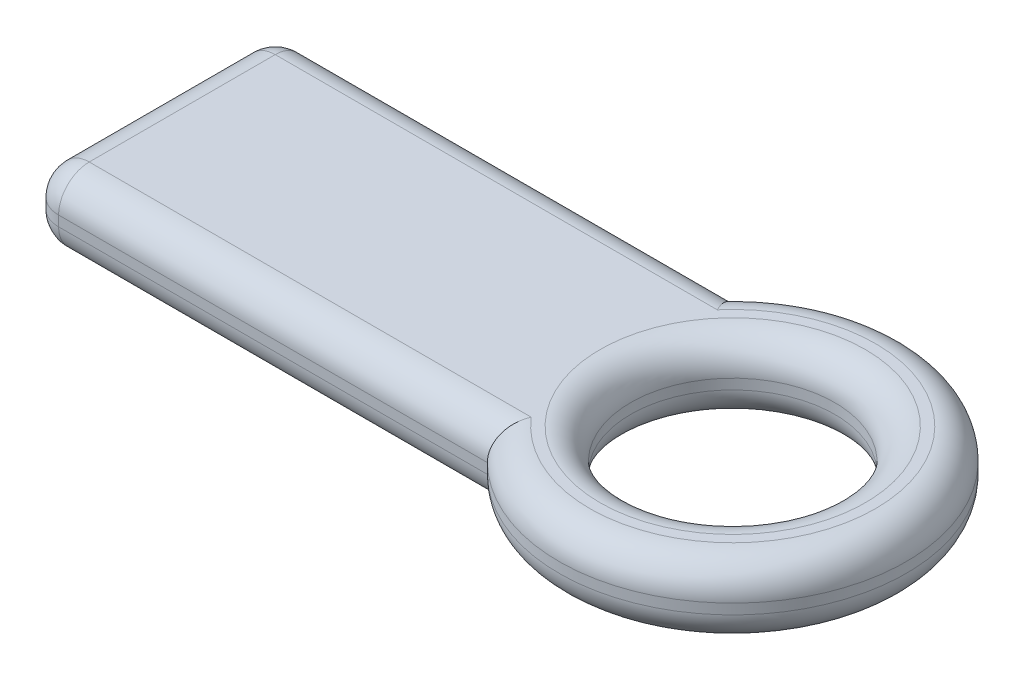
ISO-10303-21;
HEADER;
FILE_DESCRIPTION(('STEP AP214'),'2;1');
FILE_NAME('part.step','',(''),(''),'','','');
FILE_SCHEMA(('AUTOMOTIVE_DESIGN { 1 0 10303 214 1 1 1 1 }'));
ENDSEC;
DATA;
#1=APPLICATION_CONTEXT('core data for automotive mechanical design processes');
#2=APPLICATION_PROTOCOL_DEFINITION('international standard','automotive_design',2000,#1);
#3=PRODUCT_CONTEXT('',#1,'mechanical');
#4=PRODUCT('Part','Part','',(#3));
#5=PRODUCT_RELATED_PRODUCT_CATEGORY('part','',(#4));
#6=PRODUCT_DEFINITION_FORMATION('','',#4);
#7=PRODUCT_DEFINITION_CONTEXT('part definition',#1,'design');
#8=PRODUCT_DEFINITION('design','',#6,#7);
#9=PRODUCT_DEFINITION_SHAPE('','',#8);
#10=(LENGTH_UNIT() NAMED_UNIT(*) SI_UNIT(.MILLI.,.METRE.));
#11=(NAMED_UNIT(*) PLANE_ANGLE_UNIT() SI_UNIT($,.RADIAN.));
#12=(NAMED_UNIT(*) SI_UNIT($,.STERADIAN.) SOLID_ANGLE_UNIT());
#13=UNCERTAINTY_MEASURE_WITH_UNIT(LENGTH_MEASURE(1.E-05),#10,'distance_accuracy_value','');
#14=(GEOMETRIC_REPRESENTATION_CONTEXT(3) GLOBAL_UNCERTAINTY_ASSIGNED_CONTEXT((#13)) GLOBAL_UNIT_ASSIGNED_CONTEXT((#10,
#11,#12)) REPRESENTATION_CONTEXT('',''));
#15=CARTESIAN_POINT('',(0.,0.,0.));
#16=DIRECTION('',(0.,0.,1.));
#17=DIRECTION('',(1.,0.,0.));
#18=AXIS2_PLACEMENT_3D('',#15,#16,#17);
#19=CARTESIAN_POINT('',(284.65,35.,-60.555));
#20=DIRECTION('',(0.,1.,0.));
#21=DIRECTION('',(0.,0.,1.));
#22=AXIS2_PLACEMENT_3D('',#19,#20,#21);
#23=PLANE('',#22);
#24=CARTESIAN_POINT('',(284.65,35.,-60.555));
#25=DIRECTION('',(0.,1.,0.));
#26=DIRECTION('',(0.,0.,1.));
#27=AXIS2_PLACEMENT_3D('',#24,#25,#26);
#28=CIRCLE('',#27,65.);
#29=CARTESIAN_POINT('',(284.65,35.,4.445));
#30=VERTEX_POINT('',#29);
#31=EDGE_CURVE('E151',#30,#30,#28,.F.);
#32=ORIENTED_EDGE('',*,*,#31,.T.);
#33=EDGE_LOOP('',(#32));
#34=FACE_BOUND('',#33,.T.);
#35=DIRECTION('',(-1.,0.,0.));
#36=VECTOR('',#35,1.);
#37=CARTESIAN_POINT('',(0.,35.,-106.11));
#38=LINE('',#37,#36);
#39=CARTESIAN_POINT('',(231.501698286775,35.,-106.11));
#40=VERTEX_POINT('',#39);
#41=CARTESIAN_POINT('',(15.,35.,-106.11));
#42=VERTEX_POINT('',#41);
#43=EDGE_CURVE('E154',#40,#42,#38,.T.);
#44=ORIENTED_EDGE('',*,*,#43,.T.);
#45=DIRECTION('',(0.,0.,1.));
#46=VECTOR('',#45,1.);
#47=CARTESIAN_POINT('',(15.,35.,-15.));
#48=LINE('',#47,#46);
#49=CARTESIAN_POINT('',(15.,35.,-15.));
#50=VERTEX_POINT('',#49);
#51=EDGE_CURVE('E11',#42,#50,#48,.T.);
#52=ORIENTED_EDGE('',*,*,#51,.T.);
#53=DIRECTION('',(1.,0.,0.));
#54=VECTOR('',#53,1.);
#55=CARTESIAN_POINT('',(225.00025586811,35.,-15.));
#56=LINE('',#55,#54);
#57=CARTESIAN_POINT('',(231.501698286775,35.,-15.));
#58=VERTEX_POINT('',#57);
#59=EDGE_CURVE('E272',#50,#58,#56,.T.);
#60=ORIENTED_EDGE('',*,*,#59,.T.);
#61=CARTESIAN_POINT('',(284.65,35.,-60.555));
#62=DIRECTION('',(0.,1.,0.));
#63=DIRECTION('',(0.,0.,1.));
#64=AXIS2_PLACEMENT_3D('',#61,#62,#63);
#65=CIRCLE('',#64,70.);
#66=EDGE_CURVE('E270',#58,#40,#65,.T.);
#67=ORIENTED_EDGE('',*,*,#66,.T.);
#68=EDGE_LOOP('',(#44,#52,#60,#67));
#69=FACE_BOUND('',#68,.T.);
#70=ADVANCED_FACE('F39',(#34,#69),#23,.T.);
#71=CARTESIAN_POINT('',(284.65,0.,-60.555));
#72=DIRECTION('',(0.,1.,0.));
#73=DIRECTION('',(0.,0.,1.));
#74=AXIS2_PLACEMENT_3D('',#71,#72,#73);
#75=PLANE('',#74);
#76=CARTESIAN_POINT('',(284.65,0.,-60.555));
#77=DIRECTION('',(0.,1.,0.));
#78=DIRECTION('',(0.,0.,1.));
#79=AXIS2_PLACEMENT_3D('',#76,#77,#78);
#80=CIRCLE('',#79,65.);
#81=CARTESIAN_POINT('',(284.65,0.,4.445));
#82=VERTEX_POINT('',#81);
#83=EDGE_CURVE('E280',#82,#82,#80,.T.);
#84=ORIENTED_EDGE('',*,*,#83,.T.);
#85=EDGE_LOOP('',(#84));
#86=FACE_BOUND('',#85,.T.);
#87=DIRECTION('',(1.,0.,0.));
#88=VECTOR('',#87,1.);
#89=CARTESIAN_POINT('',(284.65,0.,-15.));
#90=LINE('',#89,#88);
#91=CARTESIAN_POINT('',(231.501698286775,0.,-15.));
#92=VERTEX_POINT('',#91);
#93=CARTESIAN_POINT('',(15.,0.,-15.));
#94=VERTEX_POINT('',#93);
#95=EDGE_CURVE('E287',#92,#94,#90,.F.);
#96=ORIENTED_EDGE('',*,*,#95,.T.);
#97=DIRECTION('',(0.,0.,1.));
#98=VECTOR('',#97,1.);
#99=CARTESIAN_POINT('',(15.,0.,-60.555));
#100=LINE('',#99,#98);
#101=CARTESIAN_POINT('',(15.,0.,-106.11));
#102=VERTEX_POINT('',#101);
#103=EDGE_CURVE('E48',#94,#102,#100,.F.);
#104=ORIENTED_EDGE('',*,*,#103,.T.);
#105=DIRECTION('',(-1.,0.,0.));
#106=VECTOR('',#105,1.);
#107=CARTESIAN_POINT('',(284.65,0.,-106.11));
#108=LINE('',#107,#106);
#109=CARTESIAN_POINT('',(231.501698286775,0.,-106.11));
#110=VERTEX_POINT('',#109);
#111=EDGE_CURVE('E283',#102,#110,#108,.F.);
#112=ORIENTED_EDGE('',*,*,#111,.T.);
#113=CARTESIAN_POINT('',(284.65,0.,-60.555));
#114=DIRECTION('',(0.,1.,0.));
#115=DIRECTION('',(0.,0.,1.));
#116=AXIS2_PLACEMENT_3D('',#113,#114,#115);
#117=CIRCLE('',#116,70.);
#118=EDGE_CURVE('E285',#110,#92,#117,.F.);
#119=ORIENTED_EDGE('',*,*,#118,.T.);
#120=EDGE_LOOP('',(#96,#104,#112,#119));
#121=FACE_BOUND('',#120,.T.);
#122=ADVANCED_FACE('F223',(#86,#121),#75,.F.);
#123=CARTESIAN_POINT('',(0.,35.,0.));
#124=DIRECTION('',(1.,0.,0.));
#125=DIRECTION('',(0.,0.,-1.));
#126=AXIS2_PLACEMENT_3D('',#123,#124,#125);
#127=PLANE('',#126);
#128=DIRECTION('',(0.,-1.,0.));
#129=VECTOR('',#128,1.);
#130=CARTESIAN_POINT('',(0.,35.,-106.11));
#131=LINE('',#130,#129);
#132=CARTESIAN_POINT('',(0.,20.,-106.11));
#133=VERTEX_POINT('',#132);
#134=CARTESIAN_POINT('',(0.,15.,-106.11));
#135=VERTEX_POINT('',#134);
#136=EDGE_CURVE('E342',#133,#135,#131,.T.);
#137=ORIENTED_EDGE('',*,*,#136,.T.);
#138=DIRECTION('',(0.,0.,1.));
#139=VECTOR('',#138,1.);
#140=CARTESIAN_POINT('',(0.,15.,0.));
#141=LINE('',#140,#139);
#142=CARTESIAN_POINT('',(0.,15.,-15.));
#143=VERTEX_POINT('',#142);
#144=EDGE_CURVE('E308',#135,#143,#141,.T.);
#145=ORIENTED_EDGE('',*,*,#144,.T.);
#146=DIRECTION('',(0.,-1.,0.));
#147=VECTOR('',#146,1.);
#148=CARTESIAN_POINT('',(0.,35.,-15.));
#149=LINE('',#148,#147);
#150=CARTESIAN_POINT('',(0.,20.,-15.));
#151=VERTEX_POINT('',#150);
#152=EDGE_CURVE('E344',#143,#151,#149,.F.);
#153=ORIENTED_EDGE('',*,*,#152,.T.);
#154=DIRECTION('',(0.,0.,1.));
#155=VECTOR('',#154,1.);
#156=CARTESIAN_POINT('',(0.,20.,-106.11));
#157=LINE('',#156,#155);
#158=EDGE_CURVE('E263',#151,#133,#157,.F.);
#159=ORIENTED_EDGE('',*,*,#158,.T.);
#160=EDGE_LOOP('',(#137,#145,#153,#159));
#161=FACE_BOUND('',#160,.T.);
#162=ADVANCED_FACE('F229',(#161),#127,.F.);
#163=CARTESIAN_POINT('',(0.,35.,0.));
#164=DIRECTION('',(0.,0.,-1.));
#165=DIRECTION('',(-1.,0.,0.));
#166=AXIS2_PLACEMENT_3D('',#163,#164,#165);
#167=PLANE('',#166);
#168=DIRECTION('',(1.,0.,0.));
#169=VECTOR('',#168,1.);
#170=CARTESIAN_POINT('',(0.,20.,0.));
#171=LINE('',#170,#169);
#172=CARTESIAN_POINT('',(225.00025586811,20.,0.));
#173=VERTEX_POINT('',#172);
#174=CARTESIAN_POINT('',(15.,20.,0.));
#175=VERTEX_POINT('',#174);
#176=EDGE_CURVE('E264',#173,#175,#171,.F.);
#177=ORIENTED_EDGE('',*,*,#176,.T.);
#178=DIRECTION('',(0.,-1.,0.));
#179=VECTOR('',#178,1.);
#180=CARTESIAN_POINT('',(15.,35.,0.));
#181=LINE('',#180,#179);
#182=CARTESIAN_POINT('',(15.,15.,0.));
#183=VERTEX_POINT('',#182);
#184=EDGE_CURVE('E337',#175,#183,#181,.T.);
#185=ORIENTED_EDGE('',*,*,#184,.T.);
#186=DIRECTION('',(1.,0.,0.));
#187=VECTOR('',#186,1.);
#188=CARTESIAN_POINT('',(0.,15.,0.));
#189=LINE('',#188,#187);
#190=CARTESIAN_POINT('',(225.00025586811,15.,0.));
#191=VERTEX_POINT('',#190);
#192=EDGE_CURVE('E261',#183,#191,#189,.T.);
#193=ORIENTED_EDGE('',*,*,#192,.T.);
#194=DIRECTION('',(0.,-1.,0.));
#195=VECTOR('',#194,1.);
#196=CARTESIAN_POINT('',(225.00025586811,35.,0.));
#197=LINE('',#196,#195);
#198=EDGE_CURVE('E131',#173,#191,#197,.T.);
#199=ORIENTED_EDGE('',*,*,#198,.F.);
#200=EDGE_LOOP('',(#177,#185,#193,#199));
#201=FACE_BOUND('',#200,.T.);
#202=ADVANCED_FACE('F240',(#201),#167,.F.);
#203=CARTESIAN_POINT('',(284.65,35.,-60.555));
#204=DIRECTION('',(0.,-1.,0.));
#205=DIRECTION('',(0.,0.,-1.));
#206=AXIS2_PLACEMENT_3D('',#203,#204,#205);
#207=CYLINDRICAL_SURFACE('',#206,85.);
#208=ORIENTED_EDGE('',*,*,#198,.T.);
#209=CARTESIAN_POINT('',(284.65,15.,-60.555));
#210=DIRECTION('',(0.,1.,0.));
#211=DIRECTION('',(0.,0.,1.));
#212=AXIS2_PLACEMENT_3D('',#209,#210,#211);
#213=CIRCLE('',#212,85.);
#214=CARTESIAN_POINT('',(225.00025586811,15.,-121.11));
#215=VERTEX_POINT('',#214);
#216=EDGE_CURVE('E140',#191,#215,#213,.T.);
#217=ORIENTED_EDGE('',*,*,#216,.T.);
#218=DIRECTION('',(0.,-1.,0.));
#219=VECTOR('',#218,1.);
#220=CARTESIAN_POINT('',(225.00025586811,35.,-121.11));
#221=LINE('',#220,#219);
#222=CARTESIAN_POINT('',(225.00025586811,20.,-121.11));
#223=VERTEX_POINT('',#222);
#224=EDGE_CURVE('E124',#223,#215,#221,.T.);
#225=ORIENTED_EDGE('',*,*,#224,.F.);
#226=CARTESIAN_POINT('',(284.65,20.,-60.555));
#227=DIRECTION('',(0.,1.,0.));
#228=DIRECTION('',(0.,0.,1.));
#229=AXIS2_PLACEMENT_3D('',#226,#227,#228);
#230=CIRCLE('',#229,85.);
#231=EDGE_CURVE('E137',#223,#173,#230,.F.);
#232=ORIENTED_EDGE('',*,*,#231,.T.);
#233=EDGE_LOOP('',(#208,#217,#225,#232));
#234=FACE_BOUND('',#233,.T.);
#235=ADVANCED_FACE('F136',(#234),#207,.T.);
#236=CARTESIAN_POINT('',(0.,35.,-121.11));
#237=DIRECTION('',(0.,0.,1.));
#238=DIRECTION('',(1.,0.,0.));
#239=AXIS2_PLACEMENT_3D('',#236,#237,#238);
#240=PLANE('',#239);
#241=DIRECTION('',(-1.,0.,0.));
#242=VECTOR('',#241,1.);
#243=CARTESIAN_POINT('',(0.,15.,-121.11));
#244=LINE('',#243,#242);
#245=CARTESIAN_POINT('',(15.,15.,-121.11));
#246=VERTEX_POINT('',#245);
#247=EDGE_CURVE('E130',#215,#246,#244,.T.);
#248=ORIENTED_EDGE('',*,*,#247,.T.);
#249=DIRECTION('',(0.,-1.,0.));
#250=VECTOR('',#249,1.);
#251=CARTESIAN_POINT('',(15.,35.,-121.11));
#252=LINE('',#251,#250);
#253=CARTESIAN_POINT('',(15.,20.,-121.11));
#254=VERTEX_POINT('',#253);
#255=EDGE_CURVE('E127',#246,#254,#252,.F.);
#256=ORIENTED_EDGE('',*,*,#255,.T.);
#257=DIRECTION('',(-1.,0.,0.));
#258=VECTOR('',#257,1.);
#259=CARTESIAN_POINT('',(225.00025586811,20.,-121.11));
#260=LINE('',#259,#258);
#261=EDGE_CURVE('E120',#254,#223,#260,.F.);
#262=ORIENTED_EDGE('',*,*,#261,.T.);
#263=ORIENTED_EDGE('',*,*,#224,.T.);
#264=EDGE_LOOP('',(#248,#256,#262,#263));
#265=FACE_BOUND('',#264,.T.);
#266=ADVANCED_FACE('F123',(#265),#240,.F.);
#267=CARTESIAN_POINT('',(284.65,35.,-60.555));
#268=DIRECTION('',(0.,-1.,0.));
#269=DIRECTION('',(0.,0.,-1.));
#270=AXIS2_PLACEMENT_3D('',#267,#268,#269);
#271=CYLINDRICAL_SURFACE('',#270,50.);
#272=CARTESIAN_POINT('',(284.65,15.,-60.555));
#273=DIRECTION('',(0.,1.,0.));
#274=DIRECTION('',(0.,0.,1.));
#275=AXIS2_PLACEMENT_3D('',#272,#273,#274);
#276=CIRCLE('',#275,50.);
#277=CARTESIAN_POINT('',(284.65,15.,-10.555));
#278=VERTEX_POINT('',#277);
#279=EDGE_CURVE('E274',#278,#278,#276,.F.);
#280=ORIENTED_EDGE('',*,*,#279,.T.);
#281=EDGE_LOOP('',(#280));
#282=FACE_BOUND('',#281,.T.);
#283=CARTESIAN_POINT('',(284.65,20.,-60.555));
#284=DIRECTION('',(0.,1.,0.));
#285=DIRECTION('',(0.,0.,1.));
#286=AXIS2_PLACEMENT_3D('',#283,#284,#285);
#287=CIRCLE('',#286,50.);
#288=CARTESIAN_POINT('',(284.65,20.,-10.555));
#289=VERTEX_POINT('',#288);
#290=EDGE_CURVE('E277',#289,#289,#287,.T.);
#291=ORIENTED_EDGE('',*,*,#290,.T.);
#292=EDGE_LOOP('',(#291));
#293=FACE_BOUND('',#292,.T.);
#294=ADVANCED_FACE('F234',(#282,#293),#271,.F.);
#295=CARTESIAN_POINT('',(0.,15.,-15.));
#296=DIRECTION('',(1.,0.,0.));
#297=DIRECTION('',(0.,0.,-1.));
#298=AXIS2_PLACEMENT_3D('',#295,#296,#297);
#299=CYLINDRICAL_SURFACE('',#298,15.);
#300=ORIENTED_EDGE('',*,*,#192,.F.);
#301=CARTESIAN_POINT('',(15.,15.,-15.));
#302=DIRECTION('',(1.,0.,0.));
#303=DIRECTION('',(0.,0.,-1.));
#304=AXIS2_PLACEMENT_3D('',#301,#302,#303);
#305=CIRCLE('',#304,15.);
#306=EDGE_CURVE('E62',#183,#94,#305,.T.);
#307=ORIENTED_EDGE('',*,*,#306,.T.);
#308=ORIENTED_EDGE('',*,*,#95,.F.);
#309=CARTESIAN_POINT('',(225.00025586811,15.,0.));
#310=CARTESIAN_POINT('',(225.000255807494,14.8007069053335,6.64547626748508E-07));
#311=CARTESIAN_POINT('',(225.001883817683,14.6014391188507,-0.00397252545556941));
#312=CARTESIAN_POINT('',(225.00839042128,14.2032789130897,-0.0198485816888192));
#313=CARTESIAN_POINT('',(225.01326891532,14.004386482523,-0.0317512055157053));
#314=CARTESIAN_POINT('',(225.032766680539,13.4089015315127,-0.0793137259211589));
#315=CARTESIAN_POINT('',(225.052248244729,13.0133397414191,-0.126828302427761));
#316=CARTESIAN_POINT('',(225.103943040883,12.2291399953268,-0.252807053070138));
#317=CARTESIAN_POINT('',(225.136123058065,11.8404867186587,-0.331190483851694));
#318=CARTESIAN_POINT('',(225.212947154574,11.0717435282955,-0.518105923828764));
#319=CARTESIAN_POINT('',(225.257591414536,10.6916537387911,-0.626638369952767));
#320=CARTESIAN_POINT('',(225.358965077365,9.94277435441357,-0.872728955280282));
#321=CARTESIAN_POINT('',(225.415691291013,9.57398180678616,-1.01027943463417));
#322=CARTESIAN_POINT('',(225.540789606733,8.84999540891801,-1.31309330520272));
#323=CARTESIAN_POINT('',(225.60916216063,8.49480208692149,-1.47835777159237));
#324=CARTESIAN_POINT('',(225.7570504584,7.80014953839465,-1.83509788374707));
#325=CARTESIAN_POINT('',(225.836568981179,7.46069426383717,-2.026580065819));
#326=CARTESIAN_POINT('',(226.006158646026,6.79958407311755,-2.43401583051706));
#327=CARTESIAN_POINT('',(226.096229969421,6.47792946295884,-2.6499698336332));
#328=CARTESIAN_POINT('',(226.289033888297,5.84519597961755,-3.1110485757009));
#329=CARTESIAN_POINT('',(226.392055813473,5.53468612459604,-3.35683295367161));
#330=CARTESIAN_POINT('',(226.607894320642,4.93597079006056,-3.87027178342016));
#331=CARTESIAN_POINT('',(226.720711058306,4.64776566518312,-4.13792658279017));
#332=CARTESIAN_POINT('',(226.955421934524,4.09497948792183,-4.69301306065146));
#333=CARTESIAN_POINT('',(227.077317715261,3.83040272847281,-4.98044831623928));
#334=CARTESIAN_POINT('',(227.329421536926,3.32604692273599,-5.57290139469695));
#335=CARTESIAN_POINT('',(227.45963015841,3.0862696114716,-5.87792044544556));
#336=CARTESIAN_POINT('',(227.737055415868,2.61641793256585,-6.52545064874177));
#337=CARTESIAN_POINT('',(227.884823883684,2.3882214204327,-6.86908871372112));
#338=CARTESIAN_POINT('',(228.188088621984,1.96216366894323,-7.57143652201821));
#339=CARTESIAN_POINT('',(228.343585426767,1.76430453083728,-7.93014730712388));
#340=CARTESIAN_POINT('',(228.661446293549,1.39948359491734,-8.66023926507871));
#341=CARTESIAN_POINT('',(228.823813459556,1.23253594995195,-9.03162614997965));
#342=CARTESIAN_POINT('',(229.154418808626,0.930098280231862,-9.78440912373209));
#343=CARTESIAN_POINT('',(229.32265652232,0.794605747148738,-10.1658044117809));
#344=CARTESIAN_POINT('',(229.653202448778,0.562968489822688,-10.9116339611819));
#345=CARTESIAN_POINT('',(229.815204313547,0.464865104533825,-11.2755981982644));
#346=CARTESIAN_POINT('',(230.142825026456,0.296560682895647,-12.0083182691804));
#347=CARTESIAN_POINT('',(230.308443850105,0.226359457682625,-12.3770740705634));
#348=CARTESIAN_POINT('',(230.642239116265,0.113986971727603,-13.116824460089));
#349=CARTESIAN_POINT('',(230.810410294845,0.071764398138829,-13.4878136835911));
#350=CARTESIAN_POINT('',(231.148827488164,0.0151047253510418,-14.2308268021003));
#351=CARTESIAN_POINT('',(231.319072495435,0.000654636628597767,-14.6028501318661));
#352=CARTESIAN_POINT('',(231.493867624735,7.24337721723401E-06,-14.9829736410812));
#353=CARTESIAN_POINT('',(231.497782791686,-4.01449089833255E-09,-14.9914869351255));
#354=CARTESIAN_POINT('',(231.501698286775,0.,-15.));
#355=B_SPLINE_CURVE_WITH_KNOTS('',3,(#309,#310,#311,#312,#313,#314,#315,#316,#317,#318,#319,
#320,#321,#322,#323,#324,#325,#326,#327,#328,#329,#330,#331,#332,#333,#334,#335,#336,#337,#338,
#339,#340,#341,#342,#343,#344,#345,#346,#347,#348,#349,#350,#351,#352,#353,#354),.UNSPECIFIED.,
.F.,.F.,(4,2,2,2,2,2,2,2,2,2,2,2,2,2,2,2,2,2,2,2,2,2,4),(0.,0.597782631182331,1.19554698895983,
2.39059249637935,3.58253267817238,4.774490134818,5.96613334493734,7.15782279602114,
8.34980988856699,9.5418174656809,10.7680582662373,11.994318559542,13.2208011954024,
14.4473695806981,15.7604686641548,17.0736586554388,18.3874484129094,19.7011333686859,
20.9310180234198,22.1608943531879,23.3885088005724,24.6155489381345,24.6436601830958),.UNSPECIFIED.);
#356=EDGE_CURVE('E141',#191,#92,#355,.T.);
#357=ORIENTED_EDGE('',*,*,#356,.F.);
#358=EDGE_LOOP('',(#300,#307,#308,#357));
#359=FACE_BOUND('',#358,.T.);
#360=ADVANCED_FACE('F251',(#359),#299,.T.);
#361=CARTESIAN_POINT('',(284.65,15.,-60.555));
#362=DIRECTION('',(0.,1.,0.));
#363=DIRECTION('',(0.,0.,1.));
#364=AXIS2_PLACEMENT_3D('',#361,#362,#363);
#365=TOROIDAL_SURFACE('',#364,70.,15.);
#366=ORIENTED_EDGE('',*,*,#356,.T.);
#367=ORIENTED_EDGE('',*,*,#118,.F.);
#368=CARTESIAN_POINT('',(225.00025586811,15.,-121.11));
#369=CARTESIAN_POINT('',(225.000255807494,14.8007069053335,-121.110000664548));
#370=CARTESIAN_POINT('',(225.001883817683,14.6014391188507,-121.106027474544));
#371=CARTESIAN_POINT('',(225.00839042128,14.2032789130896,-121.090151418311));
#372=CARTESIAN_POINT('',(225.01326891532,14.004386482523,-121.078248794484));
#373=CARTESIAN_POINT('',(225.032766680539,13.4089015315127,-121.030686274079));
#374=CARTESIAN_POINT('',(225.052248244729,13.0133397414191,-120.983171697572));
#375=CARTESIAN_POINT('',(225.103943040883,12.2291399953267,-120.85719294693));
#376=CARTESIAN_POINT('',(225.136123058065,11.8404867186587,-120.778809516148));
#377=CARTESIAN_POINT('',(225.212947154574,11.0717435282955,-120.591894076171));
#378=CARTESIAN_POINT('',(225.257591414536,10.6916537387911,-120.483361630047));
#379=CARTESIAN_POINT('',(225.358965077365,9.94277435441357,-120.23727104472));
#380=CARTESIAN_POINT('',(225.415691291013,9.57398180678616,-120.099720565366));
#381=CARTESIAN_POINT('',(225.540789606733,8.84999540891801,-119.796906694797));
#382=CARTESIAN_POINT('',(225.60916216063,8.49480208692148,-119.631642228408));
#383=CARTESIAN_POINT('',(225.7570504584,7.80014953839465,-119.274902116253));
#384=CARTESIAN_POINT('',(225.836568981179,7.46069426383717,-119.083419934181));
#385=CARTESIAN_POINT('',(226.006158646026,6.79958407311755,-118.675984169483));
#386=CARTESIAN_POINT('',(226.096229969421,6.47792946295884,-118.460030166367));
#387=CARTESIAN_POINT('',(226.289033888297,5.84519597961755,-117.998951424299));
#388=CARTESIAN_POINT('',(226.392055813473,5.53468612459604,-117.753167046328));
#389=CARTESIAN_POINT('',(226.607894320642,4.93597079006056,-117.23972821658));
#390=CARTESIAN_POINT('',(226.720711058306,4.64776566518313,-116.97207341721));
#391=CARTESIAN_POINT('',(226.955421934524,4.09497948792183,-116.416986939349));
#392=CARTESIAN_POINT('',(227.077317715261,3.83040272847281,-116.129551683761));
#393=CARTESIAN_POINT('',(227.329421536926,3.32604692273599,-115.537098605303));
#394=CARTESIAN_POINT('',(227.45963015841,3.0862696114716,-115.232079554554));
#395=CARTESIAN_POINT('',(227.737055415868,2.61641793256585,-114.584549351258));
#396=CARTESIAN_POINT('',(227.884823883684,2.3882214204327,-114.240911286279));
#397=CARTESIAN_POINT('',(228.188088621984,1.96216366894323,-113.538563477982));
#398=CARTESIAN_POINT('',(228.343585426767,1.76430453083728,-113.179852692876));
#399=CARTESIAN_POINT('',(228.661446293549,1.39948359491734,-112.449760734921));
#400=CARTESIAN_POINT('',(228.823813459556,1.23253594995195,-112.07837385002));
#401=CARTESIAN_POINT('',(229.154418808626,0.930098280231864,-111.325590876268));
#402=CARTESIAN_POINT('',(229.32265652232,0.794605747148738,-110.944195588219));
#403=CARTESIAN_POINT('',(229.653202448778,0.562968489822686,-110.198366038818));
#404=CARTESIAN_POINT('',(229.815204313547,0.464865104533823,-109.834401801736));
#405=CARTESIAN_POINT('',(230.142825026456,0.296560682895646,-109.10168173082));
#406=CARTESIAN_POINT('',(230.308443850105,0.226359457682624,-108.732925929437));
#407=CARTESIAN_POINT('',(230.642239116265,0.113986971727605,-107.993175539911));
#408=CARTESIAN_POINT('',(230.810410294845,0.0717643981388342,-107.622186316409));
#409=CARTESIAN_POINT('',(231.148827488164,0.0151047253510359,-106.8791731979));
#410=CARTESIAN_POINT('',(231.319072495435,0.000654636628576672,-106.507149868134));
#411=CARTESIAN_POINT('',(231.493867624735,7.24337721627396E-06,-106.127026358919));
#412=CARTESIAN_POINT('',(231.497782791686,-4.01449138907141E-09,-106.118513064874));
#413=CARTESIAN_POINT('',(231.501698286775,0.,-106.11));
#414=B_SPLINE_CURVE_WITH_KNOTS('',3,(#368,#369,#370,#371,#372,#373,#374,#375,#376,#377,#378,
#379,#380,#381,#382,#383,#384,#385,#386,#387,#388,#389,#390,#391,#392,#393,#394,#395,#396,#397,
#398,#399,#400,#401,#402,#403,#404,#405,#406,#407,#408,#409,#410,#411,#412,#413),.UNSPECIFIED.,
.F.,.F.,(4,2,2,2,2,2,2,2,2,2,2,2,2,2,2,2,2,2,2,2,2,2,4),(0.,0.597782631182332,1.19554698895984,
2.39059249637936,3.58253267817239,4.774490134818,5.96613334493734,7.15782279602114,
8.34980988856698,9.5418174656809,10.7680582662373,11.9943185595419,13.2208011954024,
14.4473695806982,15.7604686641548,17.0736586554388,18.3874484129094,19.7011333686858,
20.9310180234198,22.1608943531879,23.3885088005724,24.6155489381345,24.6436601830958),.UNSPECIFIED.);
#415=EDGE_CURVE('E157',#215,#110,#414,.T.);
#416=ORIENTED_EDGE('',*,*,#415,.F.);
#417=ORIENTED_EDGE('',*,*,#216,.F.);
#418=EDGE_LOOP('',(#366,#367,#416,#417));
#419=FACE_BOUND('',#418,.T.);
#420=ADVANCED_FACE('F246',(#419),#365,.T.);
#421=CARTESIAN_POINT('',(0.,15.,-106.11));
#422=DIRECTION('',(-1.,0.,0.));
#423=DIRECTION('',(0.,0.,1.));
#424=AXIS2_PLACEMENT_3D('',#421,#422,#423);
#425=CYLINDRICAL_SURFACE('',#424,15.);
#426=ORIENTED_EDGE('',*,*,#111,.F.);
#427=CARTESIAN_POINT('',(15.,15.,-106.11));
#428=DIRECTION('',(-1.,0.,0.));
#429=DIRECTION('',(0.,0.,1.));
#430=AXIS2_PLACEMENT_3D('',#427,#428,#429);
#431=CIRCLE('',#430,15.);
#432=EDGE_CURVE('E299',#102,#246,#431,.F.);
#433=ORIENTED_EDGE('',*,*,#432,.T.);
#434=ORIENTED_EDGE('',*,*,#247,.F.);
#435=ORIENTED_EDGE('',*,*,#415,.T.);
#436=EDGE_LOOP('',(#426,#433,#434,#435));
#437=FACE_BOUND('',#436,.T.);
#438=ADVANCED_FACE('F250',(#437),#425,.T.);
#439=CARTESIAN_POINT('',(284.65,15.,-60.555));
#440=DIRECTION('',(0.,1.,0.));
#441=DIRECTION('',(0.,0.,1.));
#442=AXIS2_PLACEMENT_3D('',#439,#440,#441);
#443=TOROIDAL_SURFACE('',#442,65.,15.);
#444=ORIENTED_EDGE('',*,*,#279,.F.);
#445=EDGE_LOOP('',(#444));
#446=FACE_BOUND('',#445,.T.);
#447=ORIENTED_EDGE('',*,*,#83,.F.);
#448=EDGE_LOOP('',(#447));
#449=FACE_BOUND('',#448,.T.);
#450=ADVANCED_FACE('F351',(#446,#449),#443,.T.);
#451=CARTESIAN_POINT('',(284.65,20.,-60.555));
#452=DIRECTION('',(0.,1.,0.));
#453=DIRECTION('',(0.,0.,1.));
#454=AXIS2_PLACEMENT_3D('',#451,#452,#453);
#455=TOROIDAL_SURFACE('',#454,65.,15.);
#456=ORIENTED_EDGE('',*,*,#31,.F.);
#457=EDGE_LOOP('',(#456));
#458=FACE_BOUND('',#457,.T.);
#459=ORIENTED_EDGE('',*,*,#290,.F.);
#460=EDGE_LOOP('',(#459));
#461=FACE_BOUND('',#460,.T.);
#462=ADVANCED_FACE('F190',(#458,#461),#455,.T.);
#463=CARTESIAN_POINT('',(284.65,20.,-15.));
#464=DIRECTION('',(-1.,0.,0.));
#465=DIRECTION('',(0.,0.,1.));
#466=AXIS2_PLACEMENT_3D('',#463,#464,#465);
#467=CYLINDRICAL_SURFACE('',#466,15.);
#468=ORIENTED_EDGE('',*,*,#59,.F.);
#469=CARTESIAN_POINT('',(15.,20.,-15.));
#470=DIRECTION('',(-1.,0.,0.));
#471=DIRECTION('',(0.,0.,1.));
#472=AXIS2_PLACEMENT_3D('',#469,#470,#471);
#473=CIRCLE('',#472,15.);
#474=EDGE_CURVE('E333',#50,#175,#473,.F.);
#475=ORIENTED_EDGE('',*,*,#474,.T.);
#476=ORIENTED_EDGE('',*,*,#176,.F.);
#477=CARTESIAN_POINT('',(225.00025586811,20.,0.));
#478=CARTESIAN_POINT('',(225.000255807494,20.1992930946665,6.64547627843569E-07));
#479=CARTESIAN_POINT('',(225.001883817683,20.3985608811493,-0.00397252545556843));
#480=CARTESIAN_POINT('',(225.00839042128,20.7967210869104,-0.0198485816888191));
#481=CARTESIAN_POINT('',(225.01326891532,20.995613517477,-0.031751205515706));
#482=CARTESIAN_POINT('',(225.032766680539,21.5910984684873,-0.0793137259211604));
#483=CARTESIAN_POINT('',(225.052248244729,21.9866602585809,-0.126828302427761));
#484=CARTESIAN_POINT('',(225.103943040883,22.7708600046733,-0.252807053070138));
#485=CARTESIAN_POINT('',(225.136123058065,23.1595132813413,-0.331190483851694));
#486=CARTESIAN_POINT('',(225.212947154574,23.9282564717045,-0.518105923828764));
#487=CARTESIAN_POINT('',(225.257591414536,24.3083462612089,-0.626638369952767));
#488=CARTESIAN_POINT('',(225.358965077365,25.0572256455864,-0.872728955280282));
#489=CARTESIAN_POINT('',(225.415691291013,25.4260181932138,-1.01027943463416));
#490=CARTESIAN_POINT('',(225.540789606733,26.150004591082,-1.31309330520272));
#491=CARTESIAN_POINT('',(225.60916216063,26.5051979130785,-1.47835777159237));
#492=CARTESIAN_POINT('',(225.7570504584,27.1998504616053,-1.83509788374707));
#493=CARTESIAN_POINT('',(225.836568981179,27.5393057361628,-2.026580065819));
#494=CARTESIAN_POINT('',(226.006158646026,28.2004159268825,-2.43401583051706));
#495=CARTESIAN_POINT('',(226.096229969421,28.5220705370412,-2.6499698336332));
#496=CARTESIAN_POINT('',(226.289033888297,29.1548040203824,-3.1110485757009));
#497=CARTESIAN_POINT('',(226.392055813473,29.465313875404,-3.3568329536716));
#498=CARTESIAN_POINT('',(226.607894320642,30.0640292099394,-3.87027178342016));
#499=CARTESIAN_POINT('',(226.720711058306,30.3522343348169,-4.13792658279016));
#500=CARTESIAN_POINT('',(226.955421934524,30.9050205120782,-4.69301306065145));
#501=CARTESIAN_POINT('',(227.077317715261,31.1695972715272,-4.98044831623928));
#502=CARTESIAN_POINT('',(227.329421536926,31.673953077264,-5.57290139469694));
#503=CARTESIAN_POINT('',(227.45963015841,31.9137303885284,-5.87792044544555));
#504=CARTESIAN_POINT('',(227.737055415868,32.3835820674341,-6.52545064874176));
#505=CARTESIAN_POINT('',(227.884823883684,32.6117785795673,-6.86908871372111));
#506=CARTESIAN_POINT('',(228.188088621984,33.0378363310568,-7.5714365220182));
#507=CARTESIAN_POINT('',(228.343585426767,33.2356954691627,-7.93014730712388));
#508=CARTESIAN_POINT('',(228.661446293549,33.6005164050827,-8.66023926507871));
#509=CARTESIAN_POINT('',(228.823813459556,33.7674640500481,-9.03162614997964));
#510=CARTESIAN_POINT('',(229.154418808626,34.0699017197681,-9.78440912373209));
#511=CARTESIAN_POINT('',(229.32265652232,34.2053942528513,-10.1658044117809));
#512=CARTESIAN_POINT('',(229.653202448778,34.4370315101773,-10.9116339611819));
#513=CARTESIAN_POINT('',(229.815204313547,34.5351348954662,-11.2755981982644));
#514=CARTESIAN_POINT('',(230.142825026456,34.7034393171044,-12.0083182691804));
#515=CARTESIAN_POINT('',(230.308443850105,34.7736405423174,-12.3770740705634));
#516=CARTESIAN_POINT('',(230.642239116265,34.8860130282724,-13.1168244600889));
#517=CARTESIAN_POINT('',(230.810410294845,34.9282356018612,-13.4878136835909));
#518=CARTESIAN_POINT('',(231.148827488164,34.984895274649,-14.2308268021004));
#519=CARTESIAN_POINT('',(231.319072495434,34.9993453633714,-14.6028501318667));
#520=CARTESIAN_POINT('',(231.493867624735,34.9999927566228,-14.9829736410812));
#521=CARTESIAN_POINT('',(231.497782791686,35.0000000040145,-14.9914869351255));
#522=CARTESIAN_POINT('',(231.501698286775,35.,-15.));
#523=B_SPLINE_CURVE_WITH_KNOTS('',3,(#477,#478,#479,#480,#481,#482,#483,#484,#485,#486,#487,
#488,#489,#490,#491,#492,#493,#494,#495,#496,#497,#498,#499,#500,#501,#502,#503,#504,#505,#506,
#507,#508,#509,#510,#511,#512,#513,#514,#515,#516,#517,#518,#519,#520,#521,#522),.UNSPECIFIED.,
.F.,.F.,(4,2,2,2,2,2,2,2,2,2,2,2,2,2,2,2,2,2,2,2,2,2,4),(0.,0.597782631182332,1.19554698895983,
2.39059249637936,3.58253267817238,4.774490134818,5.96613334493734,7.15782279602114,
8.34980988856699,9.5418174656809,10.7680582662373,11.9943185595419,13.2208011954024,
14.4473695806981,15.7604686641548,17.0736586554388,18.3874484129094,19.7011333686859,
20.9310180234199,22.1608943531879,23.3885088005724,24.6155489381345,24.6436601830958),.UNSPECIFIED.);
#524=EDGE_CURVE('E150',#58,#173,#523,.F.);
#525=ORIENTED_EDGE('',*,*,#524,.F.);
#526=EDGE_LOOP('',(#468,#475,#476,#525));
#527=FACE_BOUND('',#526,.T.);
#528=ADVANCED_FACE('F185',(#527),#467,.T.);
#529=CARTESIAN_POINT('',(284.65,20.,-106.11));
#530=DIRECTION('',(1.,0.,0.));
#531=DIRECTION('',(0.,0.,-1.));
#532=AXIS2_PLACEMENT_3D('',#529,#530,#531);
#533=CYLINDRICAL_SURFACE('',#532,15.);
#534=ORIENTED_EDGE('',*,*,#261,.F.);
#535=CARTESIAN_POINT('',(15.,20.,-106.11));
#536=DIRECTION('',(1.,0.,0.));
#537=DIRECTION('',(0.,0.,-1.));
#538=AXIS2_PLACEMENT_3D('',#535,#536,#537);
#539=CIRCLE('',#538,15.);
#540=EDGE_CURVE('E307',#254,#42,#539,.T.);
#541=ORIENTED_EDGE('',*,*,#540,.T.);
#542=ORIENTED_EDGE('',*,*,#43,.F.);
#543=CARTESIAN_POINT('',(225.00025586811,20.,-121.11));
#544=CARTESIAN_POINT('',(225.000255807494,20.1992930946665,-121.110000664548));
#545=CARTESIAN_POINT('',(225.001883817683,20.3985608811493,-121.106027474544));
#546=CARTESIAN_POINT('',(225.00839042128,20.7967210869104,-121.090151418311));
#547=CARTESIAN_POINT('',(225.01326891532,20.995613517477,-121.078248794484));
#548=CARTESIAN_POINT('',(225.032766680539,21.5910984684873,-121.030686274079));
#549=CARTESIAN_POINT('',(225.052248244729,21.9866602585809,-120.983171697572));
#550=CARTESIAN_POINT('',(225.103943040883,22.7708600046733,-120.85719294693));
#551=CARTESIAN_POINT('',(225.136123058065,23.1595132813413,-120.778809516148));
#552=CARTESIAN_POINT('',(225.212947154574,23.9282564717045,-120.591894076171));
#553=CARTESIAN_POINT('',(225.257591414536,24.3083462612089,-120.483361630047));
#554=CARTESIAN_POINT('',(225.358965077365,25.0572256455864,-120.23727104472));
#555=CARTESIAN_POINT('',(225.415691291013,25.4260181932138,-120.099720565366));
#556=CARTESIAN_POINT('',(225.540789606733,26.150004591082,-119.796906694797));
#557=CARTESIAN_POINT('',(225.60916216063,26.5051979130785,-119.631642228408));
#558=CARTESIAN_POINT('',(225.7570504584,27.1998504616054,-119.274902116253));
#559=CARTESIAN_POINT('',(225.836568981179,27.5393057361628,-119.083419934181));
#560=CARTESIAN_POINT('',(226.006158646026,28.2004159268825,-118.675984169483));
#561=CARTESIAN_POINT('',(226.096229969421,28.5220705370412,-118.460030166367));
#562=CARTESIAN_POINT('',(226.289033888297,29.1548040203824,-117.998951424299));
#563=CARTESIAN_POINT('',(226.392055813473,29.4653138754039,-117.753167046328));
#564=CARTESIAN_POINT('',(226.607894320642,30.0640292099394,-117.23972821658));
#565=CARTESIAN_POINT('',(226.720711058306,30.3522343348169,-116.97207341721));
#566=CARTESIAN_POINT('',(226.955421934524,30.9050205120782,-116.416986939349));
#567=CARTESIAN_POINT('',(227.077317715261,31.1695972715272,-116.129551683761));
#568=CARTESIAN_POINT('',(227.329421536926,31.673953077264,-115.537098605303));
#569=CARTESIAN_POINT('',(227.45963015841,31.9137303885284,-115.232079554554));
#570=CARTESIAN_POINT('',(227.737055415868,32.3835820674342,-114.584549351258));
#571=CARTESIAN_POINT('',(227.884823883684,32.6117785795673,-114.240911286279));
#572=CARTESIAN_POINT('',(228.188088621984,33.0378363310568,-113.538563477982));
#573=CARTESIAN_POINT('',(228.343585426767,33.2356954691627,-113.179852692876));
#574=CARTESIAN_POINT('',(228.661446293549,33.6005164050827,-112.449760734921));
#575=CARTESIAN_POINT('',(228.823813459556,33.7674640500481,-112.07837385002));
#576=CARTESIAN_POINT('',(229.154418808626,34.0699017197681,-111.325590876268));
#577=CARTESIAN_POINT('',(229.32265652232,34.2053942528513,-110.944195588219));
#578=CARTESIAN_POINT('',(229.653202448778,34.4370315101773,-110.198366038818));
#579=CARTESIAN_POINT('',(229.815204313547,34.5351348954662,-109.834401801736));
#580=CARTESIAN_POINT('',(230.142825026456,34.7034393171044,-109.10168173082));
#581=CARTESIAN_POINT('',(230.308443850105,34.7736405423174,-108.732925929437));
#582=CARTESIAN_POINT('',(230.642239116265,34.8860130282724,-107.993175539911));
#583=CARTESIAN_POINT('',(230.810410294845,34.9282356018612,-107.622186316409));
#584=CARTESIAN_POINT('',(231.148827488164,34.984895274649,-106.8791731979));
#585=CARTESIAN_POINT('',(231.319072495435,34.9993453633714,-106.507149868134));
#586=CARTESIAN_POINT('',(231.493867624735,34.9999927566228,-106.127026358919));
#587=CARTESIAN_POINT('',(231.497782791686,35.0000000040145,-106.118513064874));
#588=CARTESIAN_POINT('',(231.501698286775,35.,-106.11));
#589=B_SPLINE_CURVE_WITH_KNOTS('',3,(#543,#544,#545,#546,#547,#548,#549,#550,#551,#552,#553,
#554,#555,#556,#557,#558,#559,#560,#561,#562,#563,#564,#565,#566,#567,#568,#569,#570,#571,#572,
#573,#574,#575,#576,#577,#578,#579,#580,#581,#582,#583,#584,#585,#586,#587,#588),.UNSPECIFIED.,
.F.,.F.,(4,2,2,2,2,2,2,2,2,2,2,2,2,2,2,2,2,2,2,2,2,2,4),(0.,0.597782631182329,1.19554698895983,
2.39059249637935,3.58253267817239,4.774490134818,5.96613334493734,7.15782279602113,
8.34980988856699,9.5418174656809,10.7680582662373,11.9943185595419,13.2208011954024,
14.4473695806982,15.7604686641548,17.0736586554388,18.3874484129094,19.7011333686859,
20.9310180234199,22.1608943531879,23.3885088005724,24.6155489381345,24.6436601830958),.UNSPECIFIED.);
#590=EDGE_CURVE('E147',#223,#40,#589,.T.);
#591=ORIENTED_EDGE('',*,*,#590,.F.);
#592=EDGE_LOOP('',(#534,#541,#542,#591));
#593=FACE_BOUND('',#592,.T.);
#594=ADVANCED_FACE('F153',(#593),#533,.T.);
#595=CARTESIAN_POINT('',(284.65,20.,-60.555));
#596=DIRECTION('',(0.,1.,0.));
#597=DIRECTION('',(0.,0.,1.));
#598=AXIS2_PLACEMENT_3D('',#595,#596,#597);
#599=TOROIDAL_SURFACE('',#598,70.,15.);
#600=ORIENTED_EDGE('',*,*,#524,.T.);
#601=ORIENTED_EDGE('',*,*,#231,.F.);
#602=ORIENTED_EDGE('',*,*,#590,.T.);
#603=ORIENTED_EDGE('',*,*,#66,.F.);
#604=EDGE_LOOP('',(#600,#601,#602,#603));
#605=FACE_BOUND('',#604,.T.);
#606=ADVANCED_FACE('F145',(#605),#599,.T.);
#607=CARTESIAN_POINT('',(15.,35.,-15.));
#608=DIRECTION('',(0.,-1.,0.));
#609=DIRECTION('',(0.,0.,-1.));
#610=AXIS2_PLACEMENT_3D('',#607,#608,#609);
#611=CYLINDRICAL_SURFACE('',#610,15.);
#612=CARTESIAN_POINT('',(15.,15.,-15.));
#613=DIRECTION('',(0.,-1.,0.));
#614=DIRECTION('',(0.,0.,-1.));
#615=AXIS2_PLACEMENT_3D('',#612,#613,#614);
#616=CIRCLE('',#615,15.);
#617=EDGE_CURVE('E160',#183,#143,#616,.T.);
#618=ORIENTED_EDGE('',*,*,#617,.F.);
#619=ORIENTED_EDGE('',*,*,#184,.F.);
#620=CARTESIAN_POINT('',(15.,20.,-15.));
#621=DIRECTION('',(0.,1.,0.));
#622=DIRECTION('',(0.,0.,1.));
#623=AXIS2_PLACEMENT_3D('',#620,#621,#622);
#624=CIRCLE('',#623,15.);
#625=EDGE_CURVE('E43',#151,#175,#624,.T.);
#626=ORIENTED_EDGE('',*,*,#625,.F.);
#627=ORIENTED_EDGE('',*,*,#152,.F.);
#628=EDGE_LOOP('',(#618,#619,#626,#627));
#629=FACE_BOUND('',#628,.T.);
#630=ADVANCED_FACE('F41',(#629),#611,.T.);
#631=CARTESIAN_POINT('',(15.,20.,-15.));
#632=DIRECTION('',(0.,0.,1.));
#633=DIRECTION('',(1.,0.,0.));
#634=AXIS2_PLACEMENT_3D('',#631,#632,#633);
#635=SPHERICAL_SURFACE('',#634,15.);
#636=ORIENTED_EDGE('',*,*,#625,.T.);
#637=ORIENTED_EDGE('',*,*,#474,.F.);
#638=CARTESIAN_POINT('',(15.,20.,-15.));
#639=DIRECTION('',(0.,0.,-1.));
#640=DIRECTION('',(-1.,0.,0.));
#641=AXIS2_PLACEMENT_3D('',#638,#639,#640);
#642=CIRCLE('',#641,15.);
#643=EDGE_CURVE('E324',#151,#50,#642,.T.);
#644=ORIENTED_EDGE('',*,*,#643,.F.);
#645=EDGE_LOOP('',(#636,#637,#644));
#646=FACE_BOUND('',#645,.T.);
#647=ADVANCED_FACE('F214',(#646),#635,.T.);
#648=CARTESIAN_POINT('',(15.,15.,-15.));
#649=DIRECTION('',(0.,0.,1.));
#650=DIRECTION('',(1.,0.,0.));
#651=AXIS2_PLACEMENT_3D('',#648,#649,#650);
#652=SPHERICAL_SURFACE('',#651,15.);
#653=ORIENTED_EDGE('',*,*,#306,.F.);
#654=ORIENTED_EDGE('',*,*,#617,.T.);
#655=CARTESIAN_POINT('',(15.,15.,-15.));
#656=DIRECTION('',(0.,0.,-1.));
#657=DIRECTION('',(-1.,0.,0.));
#658=AXIS2_PLACEMENT_3D('',#655,#656,#657);
#659=CIRCLE('',#658,15.);
#660=EDGE_CURVE('E321',#94,#143,#659,.T.);
#661=ORIENTED_EDGE('',*,*,#660,.F.);
#662=EDGE_LOOP('',(#653,#654,#661));
#663=FACE_BOUND('',#662,.T.);
#664=ADVANCED_FACE('F211',(#663),#652,.T.);
#665=CARTESIAN_POINT('',(15.,20.,-60.555));
#666=DIRECTION('',(0.,0.,-1.));
#667=DIRECTION('',(-1.,0.,0.));
#668=AXIS2_PLACEMENT_3D('',#665,#666,#667);
#669=CYLINDRICAL_SURFACE('',#668,15.);
#670=ORIENTED_EDGE('',*,*,#643,.T.);
#671=ORIENTED_EDGE('',*,*,#51,.F.);
#672=CARTESIAN_POINT('',(15.,20.,-106.11));
#673=DIRECTION('',(0.,0.,-1.));
#674=DIRECTION('',(-1.,0.,0.));
#675=AXIS2_PLACEMENT_3D('',#672,#673,#674);
#676=CIRCLE('',#675,15.);
#677=EDGE_CURVE('E318',#133,#42,#676,.T.);
#678=ORIENTED_EDGE('',*,*,#677,.F.);
#679=ORIENTED_EDGE('',*,*,#158,.F.);
#680=EDGE_LOOP('',(#670,#671,#678,#679));
#681=FACE_BOUND('',#680,.T.);
#682=ADVANCED_FACE('F207',(#681),#669,.T.);
#683=CARTESIAN_POINT('',(15.,15.,0.));
#684=DIRECTION('',(0.,0.,1.));
#685=DIRECTION('',(1.,0.,0.));
#686=AXIS2_PLACEMENT_3D('',#683,#684,#685);
#687=CYLINDRICAL_SURFACE('',#686,15.);
#688=ORIENTED_EDGE('',*,*,#660,.T.);
#689=ORIENTED_EDGE('',*,*,#144,.F.);
#690=CARTESIAN_POINT('',(15.,15.,-106.11));
#691=DIRECTION('',(0.,0.,-1.));
#692=DIRECTION('',(-1.,0.,0.));
#693=AXIS2_PLACEMENT_3D('',#690,#691,#692);
#694=CIRCLE('',#693,15.);
#695=EDGE_CURVE('E311',#102,#135,#694,.T.);
#696=ORIENTED_EDGE('',*,*,#695,.F.);
#697=ORIENTED_EDGE('',*,*,#103,.F.);
#698=EDGE_LOOP('',(#688,#689,#696,#697));
#699=FACE_BOUND('',#698,.T.);
#700=ADVANCED_FACE('F203',(#699),#687,.T.);
#701=CARTESIAN_POINT('',(15.,20.,-106.11));
#702=DIRECTION('',(0.,0.,1.));
#703=DIRECTION('',(1.,0.,0.));
#704=AXIS2_PLACEMENT_3D('',#701,#702,#703);
#705=SPHERICAL_SURFACE('',#704,15.);
#706=ORIENTED_EDGE('',*,*,#677,.T.);
#707=ORIENTED_EDGE('',*,*,#540,.F.);
#708=CARTESIAN_POINT('',(15.,20.,-106.11));
#709=DIRECTION('',(0.,-1.,0.));
#710=DIRECTION('',(0.,0.,-1.));
#711=AXIS2_PLACEMENT_3D('',#708,#709,#710);
#712=CIRCLE('',#711,15.);
#713=EDGE_CURVE('E305',#133,#254,#712,.T.);
#714=ORIENTED_EDGE('',*,*,#713,.F.);
#715=EDGE_LOOP('',(#706,#707,#714));
#716=FACE_BOUND('',#715,.T.);
#717=ADVANCED_FACE('F199',(#716),#705,.T.);
#718=CARTESIAN_POINT('',(15.,15.,-106.11));
#719=DIRECTION('',(0.,0.,1.));
#720=DIRECTION('',(1.,0.,0.));
#721=AXIS2_PLACEMENT_3D('',#718,#719,#720);
#722=SPHERICAL_SURFACE('',#721,15.);
#723=ORIENTED_EDGE('',*,*,#432,.F.);
#724=ORIENTED_EDGE('',*,*,#695,.T.);
#725=CARTESIAN_POINT('',(15.,15.,-106.11));
#726=DIRECTION('',(0.,1.,0.));
#727=DIRECTION('',(0.,0.,1.));
#728=AXIS2_PLACEMENT_3D('',#725,#726,#727);
#729=CIRCLE('',#728,15.);
#730=EDGE_CURVE('E302',#246,#135,#729,.T.);
#731=ORIENTED_EDGE('',*,*,#730,.F.);
#732=EDGE_LOOP('',(#723,#724,#731));
#733=FACE_BOUND('',#732,.T.);
#734=ADVANCED_FACE('F195',(#733),#722,.T.);
#735=CARTESIAN_POINT('',(15.,35.,-106.11));
#736=DIRECTION('',(0.,-1.,0.));
#737=DIRECTION('',(0.,0.,-1.));
#738=AXIS2_PLACEMENT_3D('',#735,#736,#737);
#739=CYLINDRICAL_SURFACE('',#738,15.);
#740=ORIENTED_EDGE('',*,*,#713,.T.);
#741=ORIENTED_EDGE('',*,*,#255,.F.);
#742=ORIENTED_EDGE('',*,*,#730,.T.);
#743=ORIENTED_EDGE('',*,*,#136,.F.);
#744=EDGE_LOOP('',(#740,#741,#742,#743));
#745=FACE_BOUND('',#744,.T.);
#746=ADVANCED_FACE('F192',(#745),#739,.T.);
#747=CLOSED_SHELL('',(#70,#122,#162,#202,#235,#266,#294,#360,#420,#438,#450,#462,#528,#594,#606,
#630,#647,#664,#682,#700,#717,#734,#746));
#748=MANIFOLD_SOLID_BREP('B2',#747);
#749=ADVANCED_BREP_SHAPE_REPRESENTATION('',(#18,#748),#14);
#750=SHAPE_DEFINITION_REPRESENTATION(#9,#749);
ENDSEC;
END-ISO-10303-21;
